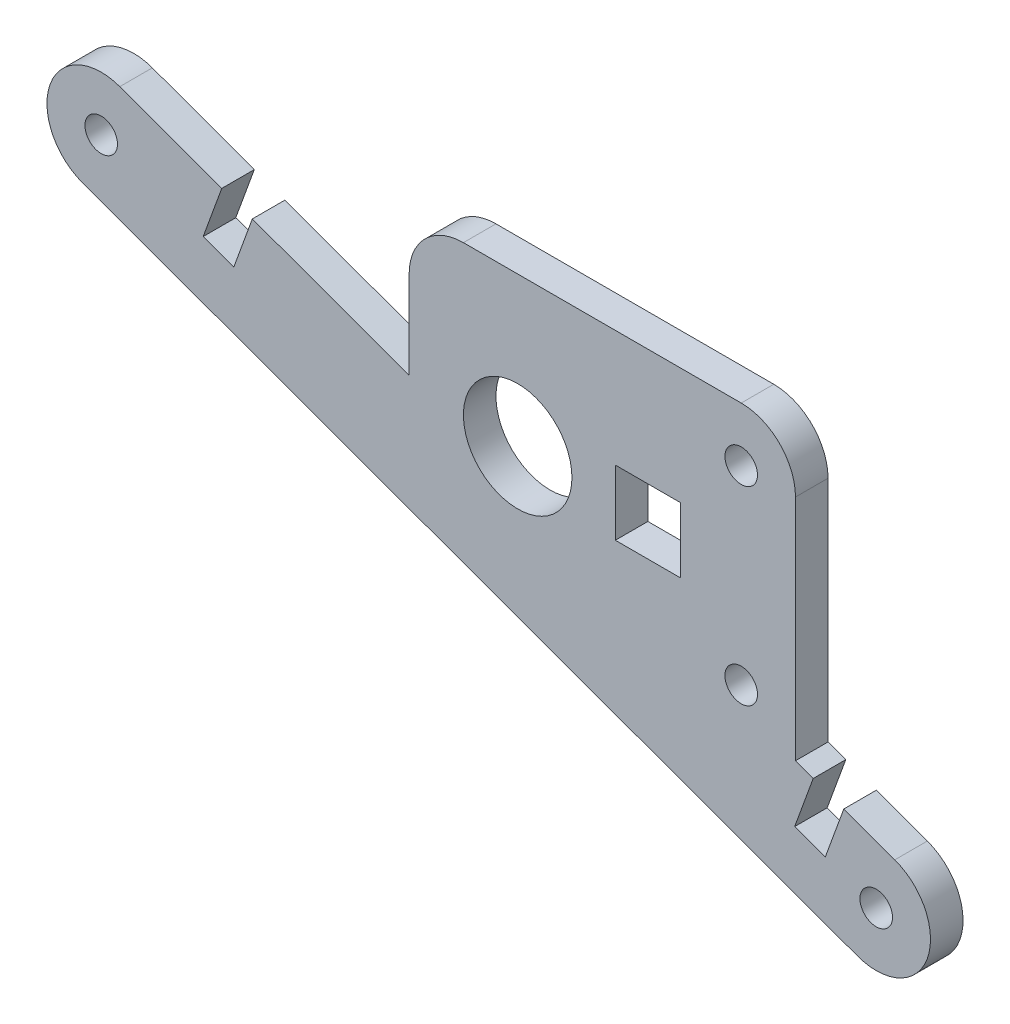
ISO-10303-21;
HEADER;
FILE_DESCRIPTION(('STEP AP214'),'2;1');
FILE_NAME('part.step','',(''),(''),'','','');
FILE_SCHEMA(('AUTOMOTIVE_DESIGN { 1 0 10303 214 1 1 1 1 }'));
ENDSEC;
DATA;
#1=APPLICATION_CONTEXT('core data for automotive mechanical design processes');
#2=APPLICATION_PROTOCOL_DEFINITION('international standard','automotive_design',2000,#1);
#3=PRODUCT_CONTEXT('',#1,'mechanical');
#4=PRODUCT('Part','Part','',(#3));
#5=PRODUCT_RELATED_PRODUCT_CATEGORY('part','',(#4));
#6=PRODUCT_DEFINITION_FORMATION('','',#4);
#7=PRODUCT_DEFINITION_CONTEXT('part definition',#1,'design');
#8=PRODUCT_DEFINITION('design','',#6,#7);
#9=PRODUCT_DEFINITION_SHAPE('','',#8);
#10=(LENGTH_UNIT() NAMED_UNIT(*) SI_UNIT(.MILLI.,.METRE.));
#11=(NAMED_UNIT(*) PLANE_ANGLE_UNIT() SI_UNIT($,.RADIAN.));
#12=(NAMED_UNIT(*) SI_UNIT($,.STERADIAN.) SOLID_ANGLE_UNIT());
#13=UNCERTAINTY_MEASURE_WITH_UNIT(LENGTH_MEASURE(1.E-05),#10,'distance_accuracy_value','');
#14=(GEOMETRIC_REPRESENTATION_CONTEXT(3) GLOBAL_UNCERTAINTY_ASSIGNED_CONTEXT((#13)) GLOBAL_UNIT_ASSIGNED_CONTEXT((#10,
#11,#12)) REPRESENTATION_CONTEXT('',''));
#15=CARTESIAN_POINT('',(0.,0.,0.));
#16=DIRECTION('',(0.,0.,1.));
#17=DIRECTION('',(1.,0.,0.));
#18=AXIS2_PLACEMENT_3D('',#15,#16,#17);
#19=CARTESIAN_POINT('',(-10.,0.660004579729409,3.));
#20=DIRECTION('',(-0.342020143325663,-0.939692620785911,0.));
#21=DIRECTION('',(0.939692620785911,-0.342020143325663,0.));
#22=AXIS2_PLACEMENT_3D('',#19,#20,#21);
#23=PLANE('',#22);
#24=DIRECTION('',(-0.939692620785911,0.342020143325663,0.));
#25=VECTOR('',#24,1.);
#26=CARTESIAN_POINT('',(-10.,0.660004579729409,0.));
#27=LINE('',#26,#25);
#28=CARTESIAN_POINT('',(-10.,0.660004579729409,0.));
#29=VERTEX_POINT('',#28);
#30=CARTESIAN_POINT('',(-24.4499719209596,5.91936424494102,0.));
#31=VERTEX_POINT('',#30);
#32=EDGE_CURVE('E343',#29,#31,#27,.T.);
#33=ORIENTED_EDGE('',*,*,#32,.T.);
#34=DIRECTION('',(0.,0.,-1.));
#35=VECTOR('',#34,1.);
#36=CARTESIAN_POINT('',(-24.4499719209596,5.91936424494102,3.));
#37=LINE('',#36,#35);
#38=CARTESIAN_POINT('',(-24.4499719209596,5.91936424494102,3.));
#39=VERTEX_POINT('',#38);
#40=EDGE_CURVE('E219',#39,#31,#37,.T.);
#41=ORIENTED_EDGE('',*,*,#40,.F.);
#42=DIRECTION('',(-0.939692620785911,0.342020143325663,0.));
#43=VECTOR('',#42,1.);
#44=CARTESIAN_POINT('',(-10.,0.660004579729409,3.));
#45=LINE('',#44,#43);
#46=CARTESIAN_POINT('',(-10.,0.660004579729409,3.));
#47=VERTEX_POINT('',#46);
#48=EDGE_CURVE('E210',#47,#39,#45,.T.);
#49=ORIENTED_EDGE('',*,*,#48,.F.);
#50=DIRECTION('',(0.,0.,-1.));
#51=VECTOR('',#50,1.);
#52=CARTESIAN_POINT('',(-10.,0.660004579729409,3.));
#53=LINE('',#52,#51);
#54=EDGE_CURVE('E369',#47,#29,#53,.T.);
#55=ORIENTED_EDGE('',*,*,#54,.T.);
#56=EDGE_LOOP('',(#33,#41,#49,#55));
#57=FACE_BOUND('',#56,.T.);
#58=ADVANCED_FACE('F37',(#57),#23,.F.);
#59=CARTESIAN_POINT('',(34.7506631885527,-15.6279047845757,3.));
#60=DIRECTION('',(-0.342020143325662,-0.939692620785911,0.));
#61=DIRECTION('',(0.939692620785911,-0.342020143325662,0.));
#62=AXIS2_PLACEMENT_3D('',#59,#60,#61);
#63=PLANE('',#62);
#64=DIRECTION('',(-0.939692620785911,0.342020143325662,0.));
#65=VECTOR('',#64,1.);
#66=CARTESIAN_POINT('',(34.7506631885527,-15.6279047845757,0.));
#67=LINE('',#66,#65);
#68=CARTESIAN_POINT('',(34.7506631885527,-15.6279047845758,0.));
#69=VERTEX_POINT('',#68);
#70=CARTESIAN_POINT('',(30.0522000846232,-13.9178040679474,0.));
#71=VERTEX_POINT('',#70);
#72=EDGE_CURVE('E312',#69,#71,#67,.T.);
#73=ORIENTED_EDGE('',*,*,#72,.T.);
#74=DIRECTION('',(0.,0.,-1.));
#75=VECTOR('',#74,1.);
#76=CARTESIAN_POINT('',(30.0522000846232,-13.9178040679474,3.));
#77=LINE('',#76,#75);
#78=CARTESIAN_POINT('',(30.0522000846232,-13.9178040679474,3.));
#79=VERTEX_POINT('',#78);
#80=EDGE_CURVE('E232',#79,#71,#77,.T.);
#81=ORIENTED_EDGE('',*,*,#80,.F.);
#82=DIRECTION('',(-0.939692620785911,0.342020143325662,0.));
#83=VECTOR('',#82,1.);
#84=CARTESIAN_POINT('',(34.7506631885527,-15.6279047845757,3.));
#85=LINE('',#84,#83);
#86=CARTESIAN_POINT('',(34.7506631885527,-15.6279047845758,3.));
#87=VERTEX_POINT('',#86);
#88=EDGE_CURVE('E329',#87,#79,#85,.T.);
#89=ORIENTED_EDGE('',*,*,#88,.F.);
#90=DIRECTION('',(0.,0.,-1.));
#91=VECTOR('',#90,1.);
#92=CARTESIAN_POINT('',(34.7506631885527,-15.6279047845758,3.));
#93=LINE('',#92,#91);
#94=EDGE_CURVE('E357',#87,#69,#93,.T.);
#95=ORIENTED_EDGE('',*,*,#94,.T.);
#96=EDGE_LOOP('',(#73,#81,#89,#95));
#97=FACE_BOUND('',#96,.T.);
#98=ADVANCED_FACE('F423',(#97),#63,.F.);
#99=CARTESIAN_POINT('',(20.6,8.75000000000001,3.));
#100=DIRECTION('',(0.,0.,1.));
#101=DIRECTION('',(1.,0.,0.));
#102=AXIS2_PLACEMENT_3D('',#99,#100,#101);
#103=PLANE('',#102);
#104=DIRECTION('',(-0.342020143325663,-0.93969262078591,0.));
#105=VECTOR('',#104,1.);
#106=CARTESIAN_POINT('',(-26.1600726375879,1.22090114101147,3.));
#107=LINE('',#106,#105);
#108=CARTESIAN_POINT('',(-26.1600726375879,1.22090114101147,3.));
#109=VERTEX_POINT('',#108);
#110=EDGE_CURVE('E189',#39,#109,#107,.T.);
#111=ORIENTED_EDGE('',*,*,#110,.T.);
#112=DIRECTION('',(-0.93969262078591,0.342020143325663,0.));
#113=VECTOR('',#112,1.);
#114=CARTESIAN_POINT('',(-28.9791504999457,2.24696157098846,3.));
#115=LINE('',#114,#113);
#116=CARTESIAN_POINT('',(-28.9791504999457,2.24696157098846,3.));
#117=VERTEX_POINT('',#116);
#118=EDGE_CURVE('E200',#109,#117,#115,.T.);
#119=ORIENTED_EDGE('',*,*,#118,.T.);
#120=DIRECTION('',(0.342020143325663,0.939692620785911,0.));
#121=VECTOR('',#120,1.);
#122=CARTESIAN_POINT('',(-27.2690497833174,6.94542467491801,3.));
#123=LINE('',#122,#121);
#124=CARTESIAN_POINT('',(-27.2690497833174,6.94542467491801,3.));
#125=VERTEX_POINT('',#124);
#126=EDGE_CURVE('E197',#117,#125,#123,.T.);
#127=ORIENTED_EDGE('',*,*,#126,.T.);
#128=CARTESIAN_POINT('',(-36.6659759911765,10.3656261081746,3.));
#129=VERTEX_POINT('',#128);
#130=EDGE_CURVE('E320',#125,#129,#45,.T.);
#131=ORIENTED_EDGE('',*,*,#130,.T.);
#132=CARTESIAN_POINT('',(-38.3760767078048,5.66716300424508,3.));
#133=DIRECTION('',(0.,0.,1.));
#134=DIRECTION('',(1.,0.,0.));
#135=AXIS2_PLACEMENT_3D('',#132,#133,#134);
#136=CIRCLE('',#135,5.);
#137=CARTESIAN_POINT('',(-40.0861774244331,0.96869990031553,3.));
#138=VERTEX_POINT('',#137);
#139=EDGE_CURVE('E322',#129,#138,#136,.T.);
#140=ORIENTED_EDGE('',*,*,#139,.T.);
#141=DIRECTION('',(0.939692620785911,-0.342020143325662,0.));
#142=VECTOR('',#141,1.);
#143=CARTESIAN_POINT('',(-40.0861774244331,0.968699900315528,3.));
#144=LINE('',#143,#142);
#145=CARTESIAN_POINT('',(31.3304617552961,-25.0248309924348,3.));
#146=VERTEX_POINT('',#145);
#147=EDGE_CURVE('E324',#138,#146,#144,.T.);
#148=ORIENTED_EDGE('',*,*,#147,.T.);
#149=CARTESIAN_POINT('',(33.0405624719244,-20.3263678885053,3.));
#150=DIRECTION('',(0.,0.,1.));
#151=DIRECTION('',(1.,0.,0.));
#152=AXIS2_PLACEMENT_3D('',#149,#150,#151);
#153=CIRCLE('',#152,4.99999999999998);
#154=EDGE_CURVE('E326',#146,#87,#153,.T.);
#155=ORIENTED_EDGE('',*,*,#154,.T.);
#156=ORIENTED_EDGE('',*,*,#88,.T.);
#157=DIRECTION('',(-0.342020143325663,-0.93969262078591,0.));
#158=VECTOR('',#157,1.);
#159=CARTESIAN_POINT('',(28.3420993679949,-18.616267171877,3.));
#160=LINE('',#159,#158);
#161=CARTESIAN_POINT('',(28.3420993679949,-18.616267171877,3.));
#162=VERTEX_POINT('',#161);
#163=EDGE_CURVE('E236',#79,#162,#160,.T.);
#164=ORIENTED_EDGE('',*,*,#163,.T.);
#165=DIRECTION('',(-0.93969262078591,0.342020143325664,0.));
#166=VECTOR('',#165,1.);
#167=CARTESIAN_POINT('',(25.5230215056371,-17.5902067419,3.));
#168=LINE('',#167,#166);
#169=CARTESIAN_POINT('',(25.5230215056371,-17.5902067419,3.));
#170=VERTEX_POINT('',#169);
#171=EDGE_CURVE('E243',#162,#170,#168,.T.);
#172=ORIENTED_EDGE('',*,*,#171,.T.);
#173=DIRECTION('',(0.342020143325664,0.93969262078591,0.));
#174=VECTOR('',#173,1.);
#175=CARTESIAN_POINT('',(27.2331222222655,-12.8917436379704,3.));
#176=LINE('',#175,#174);
#177=CARTESIAN_POINT('',(27.2331222222655,-12.8917436379704,3.));
#178=VERTEX_POINT('',#177);
#179=EDGE_CURVE('E227',#170,#178,#176,.T.);
#180=ORIENTED_EDGE('',*,*,#179,.T.);
#181=CARTESIAN_POINT('',(25.6,-12.2973357601472,3.));
#182=VERTEX_POINT('',#181);
#183=EDGE_CURVE('E328',#178,#182,#85,.T.);
#184=ORIENTED_EDGE('',*,*,#183,.T.);
#185=DIRECTION('',(0.,1.,0.));
#186=VECTOR('',#185,1.);
#187=CARTESIAN_POINT('',(25.6,-12.2973357601472,3.));
#188=LINE('',#187,#186);
#189=CARTESIAN_POINT('',(25.6,8.74999999999997,3.));
#190=VERTEX_POINT('',#189);
#191=EDGE_CURVE('E309',#182,#190,#188,.T.);
#192=ORIENTED_EDGE('',*,*,#191,.T.);
#193=CARTESIAN_POINT('',(20.6,8.75000000000001,3.));
#194=DIRECTION('',(0.,0.,1.));
#195=DIRECTION('',(1.,0.,0.));
#196=AXIS2_PLACEMENT_3D('',#193,#194,#195);
#197=CIRCLE('',#196,5.);
#198=CARTESIAN_POINT('',(20.6,13.75,3.));
#199=VERTEX_POINT('',#198);
#200=EDGE_CURVE('E311',#190,#199,#197,.T.);
#201=ORIENTED_EDGE('',*,*,#200,.T.);
#202=DIRECTION('',(-1.,0.,0.));
#203=VECTOR('',#202,1.);
#204=CARTESIAN_POINT('',(20.6,13.75,3.));
#205=LINE('',#204,#203);
#206=CARTESIAN_POINT('',(-4.99999999999997,13.75,3.));
#207=VERTEX_POINT('',#206);
#208=EDGE_CURVE('E314',#199,#207,#205,.T.);
#209=ORIENTED_EDGE('',*,*,#208,.T.);
#210=CARTESIAN_POINT('',(-5.,8.75,3.));
#211=DIRECTION('',(0.,0.,1.));
#212=DIRECTION('',(-1.,0.,0.));
#213=AXIS2_PLACEMENT_3D('',#210,#211,#212);
#214=CIRCLE('',#213,5.);
#215=CARTESIAN_POINT('',(-10.,8.74999999999996,3.));
#216=VERTEX_POINT('',#215);
#217=EDGE_CURVE('E316',#207,#216,#214,.T.);
#218=ORIENTED_EDGE('',*,*,#217,.T.);
#219=DIRECTION('',(0.,-1.,0.));
#220=VECTOR('',#219,1.);
#221=CARTESIAN_POINT('',(-10.,8.74999999999997,3.));
#222=LINE('',#221,#220);
#223=EDGE_CURVE('E318',#216,#47,#222,.T.);
#224=ORIENTED_EDGE('',*,*,#223,.T.);
#225=ORIENTED_EDGE('',*,*,#48,.T.);
#226=EDGE_LOOP('',(#111,#119,#127,#131,#140,#148,#155,#156,#164,#172,#180,#184,#192,#201,#209,
#218,#224,#225));
#227=FACE_BOUND('',#226,.T.);
#228=CARTESIAN_POINT('',(-38.3760767078048,5.66716300424508,3.));
#229=DIRECTION('',(0.,0.,1.));
#230=DIRECTION('',(1.,0.,0.));
#231=AXIS2_PLACEMENT_3D('',#228,#229,#230);
#232=CIRCLE('',#231,1.5);
#233=CARTESIAN_POINT('',(-36.8760767078048,5.66716300424508,3.));
#234=VERTEX_POINT('',#233);
#235=EDGE_CURVE('E254',#234,#234,#232,.T.);
#236=ORIENTED_EDGE('',*,*,#235,.F.);
#237=EDGE_LOOP('',(#236));
#238=FACE_BOUND('',#237,.T.);
#239=CARTESIAN_POINT('',(20.6,8.75,3.));
#240=DIRECTION('',(0.,0.,1.));
#241=DIRECTION('',(1.,0.,0.));
#242=AXIS2_PLACEMENT_3D('',#239,#240,#241);
#243=CIRCLE('',#242,1.5);
#244=CARTESIAN_POINT('',(22.1,8.75,3.));
#245=VERTEX_POINT('',#244);
#246=EDGE_CURVE('E297',#245,#245,#243,.T.);
#247=ORIENTED_EDGE('',*,*,#246,.F.);
#248=EDGE_LOOP('',(#247));
#249=FACE_BOUND('',#248,.T.);
#250=CARTESIAN_POINT('',(0.,0.,3.));
#251=DIRECTION('',(0.,0.,1.));
#252=DIRECTION('',(1.,0.,0.));
#253=AXIS2_PLACEMENT_3D('',#250,#251,#252);
#254=CIRCLE('',#253,5.);
#255=CARTESIAN_POINT('',(5.,0.,3.));
#256=VERTEX_POINT('',#255);
#257=EDGE_CURVE('E303',#256,#256,#254,.T.);
#258=ORIENTED_EDGE('',*,*,#257,.F.);
#259=EDGE_LOOP('',(#258));
#260=FACE_BOUND('',#259,.T.);
#261=CARTESIAN_POINT('',(20.6,-8.75,3.));
#262=DIRECTION('',(0.,0.,1.));
#263=DIRECTION('',(1.,0.,0.));
#264=AXIS2_PLACEMENT_3D('',#261,#262,#263);
#265=CIRCLE('',#264,1.5);
#266=CARTESIAN_POINT('',(22.1,-8.75,3.));
#267=VERTEX_POINT('',#266);
#268=EDGE_CURVE('E291',#267,#267,#265,.T.);
#269=ORIENTED_EDGE('',*,*,#268,.F.);
#270=EDGE_LOOP('',(#269));
#271=FACE_BOUND('',#270,.T.);
#272=DIRECTION('',(-1.,0.,0.));
#273=VECTOR('',#272,1.);
#274=CARTESIAN_POINT('',(9.,3.,3.));
#275=LINE('',#274,#273);
#276=CARTESIAN_POINT('',(15.,3.,3.));
#277=VERTEX_POINT('',#276);
#278=CARTESIAN_POINT('',(9.,3.,3.));
#279=VERTEX_POINT('',#278);
#280=EDGE_CURVE('E262',#277,#279,#275,.T.);
#281=ORIENTED_EDGE('',*,*,#280,.F.);
#282=DIRECTION('',(0.,1.,0.));
#283=VECTOR('',#282,1.);
#284=CARTESIAN_POINT('',(15.,-3.,3.));
#285=LINE('',#284,#283);
#286=CARTESIAN_POINT('',(15.,-3.,3.));
#287=VERTEX_POINT('',#286);
#288=EDGE_CURVE('E260',#287,#277,#285,.T.);
#289=ORIENTED_EDGE('',*,*,#288,.F.);
#290=DIRECTION('',(1.,0.,0.));
#291=VECTOR('',#290,1.);
#292=CARTESIAN_POINT('',(9.,-3.,3.));
#293=LINE('',#292,#291);
#294=CARTESIAN_POINT('',(9.,-3.,3.));
#295=VERTEX_POINT('',#294);
#296=EDGE_CURVE('E268',#295,#287,#293,.T.);
#297=ORIENTED_EDGE('',*,*,#296,.F.);
#298=DIRECTION('',(0.,-1.,0.));
#299=VECTOR('',#298,1.);
#300=CARTESIAN_POINT('',(9.,-3.,3.));
#301=LINE('',#300,#299);
#302=EDGE_CURVE('E265',#279,#295,#301,.T.);
#303=ORIENTED_EDGE('',*,*,#302,.F.);
#304=EDGE_LOOP('',(#281,#289,#297,#303));
#305=FACE_BOUND('',#304,.T.);
#306=CARTESIAN_POINT('',(33.0405624719244,-20.3263678885053,3.));
#307=DIRECTION('',(0.,0.,1.));
#308=DIRECTION('',(1.,0.,0.));
#309=AXIS2_PLACEMENT_3D('',#306,#307,#308);
#310=CIRCLE('',#309,1.5);
#311=CARTESIAN_POINT('',(34.5405624719244,-20.3263678885053,3.));
#312=VERTEX_POINT('',#311);
#313=EDGE_CURVE('E248',#312,#312,#310,.T.);
#314=ORIENTED_EDGE('',*,*,#313,.F.);
#315=EDGE_LOOP('',(#314));
#316=FACE_BOUND('',#315,.T.);
#317=ADVANCED_FACE('F207',(#227,#238,#249,#260,#271,#305,#316),#103,.T.);
#318=CARTESIAN_POINT('',(20.6,8.75000000000001,0.));
#319=DIRECTION('',(0.,0.,1.));
#320=DIRECTION('',(1.,0.,0.));
#321=AXIS2_PLACEMENT_3D('',#318,#319,#320);
#322=PLANE('',#321);
#323=CARTESIAN_POINT('',(20.6,-8.75,0.));
#324=DIRECTION('',(0.,0.,1.));
#325=DIRECTION('',(1.,0.,0.));
#326=AXIS2_PLACEMENT_3D('',#323,#324,#325);
#327=CIRCLE('',#326,1.5);
#328=CARTESIAN_POINT('',(22.1,-8.75,0.));
#329=VERTEX_POINT('',#328);
#330=EDGE_CURVE('E290',#329,#329,#327,.T.);
#331=ORIENTED_EDGE('',*,*,#330,.T.);
#332=EDGE_LOOP('',(#331));
#333=FACE_BOUND('',#332,.T.);
#334=CARTESIAN_POINT('',(20.6,8.75,0.));
#335=DIRECTION('',(0.,0.,1.));
#336=DIRECTION('',(1.,0.,0.));
#337=AXIS2_PLACEMENT_3D('',#334,#335,#336);
#338=CIRCLE('',#337,1.5);
#339=CARTESIAN_POINT('',(22.1,8.75,0.));
#340=VERTEX_POINT('',#339);
#341=EDGE_CURVE('E294',#340,#340,#338,.T.);
#342=ORIENTED_EDGE('',*,*,#341,.T.);
#343=EDGE_LOOP('',(#342));
#344=FACE_BOUND('',#343,.T.);
#345=CARTESIAN_POINT('',(0.,0.,0.));
#346=DIRECTION('',(0.,0.,1.));
#347=DIRECTION('',(1.,0.,0.));
#348=AXIS2_PLACEMENT_3D('',#345,#346,#347);
#349=CIRCLE('',#348,5.);
#350=CARTESIAN_POINT('',(5.,0.,0.));
#351=VERTEX_POINT('',#350);
#352=EDGE_CURVE('E300',#351,#351,#349,.T.);
#353=ORIENTED_EDGE('',*,*,#352,.T.);
#354=EDGE_LOOP('',(#353));
#355=FACE_BOUND('',#354,.T.);
#356=DIRECTION('',(-0.93969262078591,0.342020143325663,0.));
#357=VECTOR('',#356,1.);
#358=CARTESIAN_POINT('',(-28.9791504999457,2.24696157098846,0.));
#359=LINE('',#358,#357);
#360=CARTESIAN_POINT('',(-26.1600726375879,1.22090114101147,0.));
#361=VERTEX_POINT('',#360);
#362=CARTESIAN_POINT('',(-28.9791504999457,2.24696157098846,0.));
#363=VERTEX_POINT('',#362);
#364=EDGE_CURVE('E212',#361,#363,#359,.T.);
#365=ORIENTED_EDGE('',*,*,#364,.F.);
#366=DIRECTION('',(-0.342020143325663,-0.93969262078591,0.));
#367=VECTOR('',#366,1.);
#368=CARTESIAN_POINT('',(-26.1600726375879,1.22090114101147,0.));
#369=LINE('',#368,#367);
#370=EDGE_CURVE('E192',#31,#361,#369,.T.);
#371=ORIENTED_EDGE('',*,*,#370,.F.);
#372=ORIENTED_EDGE('',*,*,#32,.F.);
#373=DIRECTION('',(0.,-1.,0.));
#374=VECTOR('',#373,1.);
#375=CARTESIAN_POINT('',(-10.,8.74999999999997,0.));
#376=LINE('',#375,#374);
#377=CARTESIAN_POINT('',(-10.,8.74999999999996,0.));
#378=VERTEX_POINT('',#377);
#379=EDGE_CURVE('E340',#378,#29,#376,.T.);
#380=ORIENTED_EDGE('',*,*,#379,.F.);
#381=CARTESIAN_POINT('',(-5.,8.75,0.));
#382=DIRECTION('',(0.,0.,1.));
#383=DIRECTION('',(-1.,0.,0.));
#384=AXIS2_PLACEMENT_3D('',#381,#382,#383);
#385=CIRCLE('',#384,5.);
#386=CARTESIAN_POINT('',(-4.99999999999997,13.75,0.));
#387=VERTEX_POINT('',#386);
#388=EDGE_CURVE('E338',#387,#378,#385,.T.);
#389=ORIENTED_EDGE('',*,*,#388,.F.);
#390=DIRECTION('',(-1.,0.,0.));
#391=VECTOR('',#390,1.);
#392=CARTESIAN_POINT('',(20.6,13.75,0.));
#393=LINE('',#392,#391);
#394=CARTESIAN_POINT('',(20.6,13.75,0.));
#395=VERTEX_POINT('',#394);
#396=EDGE_CURVE('E336',#395,#387,#393,.T.);
#397=ORIENTED_EDGE('',*,*,#396,.F.);
#398=CARTESIAN_POINT('',(20.6,8.75000000000001,0.));
#399=DIRECTION('',(0.,0.,1.));
#400=DIRECTION('',(1.,0.,0.));
#401=AXIS2_PLACEMENT_3D('',#398,#399,#400);
#402=CIRCLE('',#401,5.);
#403=CARTESIAN_POINT('',(25.6,8.74999999999997,0.));
#404=VERTEX_POINT('',#403);
#405=EDGE_CURVE('E334',#404,#395,#402,.T.);
#406=ORIENTED_EDGE('',*,*,#405,.F.);
#407=DIRECTION('',(0.,1.,0.));
#408=VECTOR('',#407,1.);
#409=CARTESIAN_POINT('',(25.6,-12.0313580199362,0.));
#410=LINE('',#409,#408);
#411=CARTESIAN_POINT('',(25.6,-12.2973357601472,0.));
#412=VERTEX_POINT('',#411);
#413=EDGE_CURVE('E306',#412,#404,#410,.T.);
#414=ORIENTED_EDGE('',*,*,#413,.F.);
#415=CARTESIAN_POINT('',(27.2331222222655,-12.8917436379704,0.));
#416=VERTEX_POINT('',#415);
#417=EDGE_CURVE('E352',#416,#412,#67,.T.);
#418=ORIENTED_EDGE('',*,*,#417,.F.);
#419=DIRECTION('',(0.342020143325664,0.93969262078591,0.));
#420=VECTOR('',#419,1.);
#421=CARTESIAN_POINT('',(27.2331222222655,-12.8917436379704,0.));
#422=LINE('',#421,#420);
#423=CARTESIAN_POINT('',(25.5230215056371,-17.5902067419,0.));
#424=VERTEX_POINT('',#423);
#425=EDGE_CURVE('E60',#424,#416,#422,.T.);
#426=ORIENTED_EDGE('',*,*,#425,.F.);
#427=DIRECTION('',(-0.93969262078591,0.342020143325664,0.));
#428=VECTOR('',#427,1.);
#429=CARTESIAN_POINT('',(25.5230215056371,-17.5902067419,0.));
#430=LINE('',#429,#428);
#431=CARTESIAN_POINT('',(28.3420993679949,-18.616267171877,0.));
#432=VERTEX_POINT('',#431);
#433=EDGE_CURVE('E235',#432,#424,#430,.T.);
#434=ORIENTED_EDGE('',*,*,#433,.F.);
#435=DIRECTION('',(-0.342020143325663,-0.93969262078591,0.));
#436=VECTOR('',#435,1.);
#437=CARTESIAN_POINT('',(28.3420993679949,-18.616267171877,0.));
#438=LINE('',#437,#436);
#439=EDGE_CURVE('E217',#71,#432,#438,.T.);
#440=ORIENTED_EDGE('',*,*,#439,.F.);
#441=ORIENTED_EDGE('',*,*,#72,.F.);
#442=CARTESIAN_POINT('',(33.0405624719244,-20.3263678885053,0.));
#443=DIRECTION('',(0.,0.,1.));
#444=DIRECTION('',(1.,0.,0.));
#445=AXIS2_PLACEMENT_3D('',#442,#443,#444);
#446=CIRCLE('',#445,4.99999999999998);
#447=CARTESIAN_POINT('',(31.3304617552961,-25.0248309924348,0.));
#448=VERTEX_POINT('',#447);
#449=EDGE_CURVE('E350',#448,#69,#446,.T.);
#450=ORIENTED_EDGE('',*,*,#449,.F.);
#451=DIRECTION('',(0.939692620785911,-0.342020143325662,0.));
#452=VECTOR('',#451,1.);
#453=CARTESIAN_POINT('',(-40.0861774244331,0.968699900315528,0.));
#454=LINE('',#453,#452);
#455=CARTESIAN_POINT('',(-40.0861774244331,0.96869990031553,0.));
#456=VERTEX_POINT('',#455);
#457=EDGE_CURVE('E348',#456,#448,#454,.T.);
#458=ORIENTED_EDGE('',*,*,#457,.F.);
#459=CARTESIAN_POINT('',(-38.3760767078048,5.66716300424508,0.));
#460=DIRECTION('',(0.,0.,1.));
#461=DIRECTION('',(1.,0.,0.));
#462=AXIS2_PLACEMENT_3D('',#459,#460,#461);
#463=CIRCLE('',#462,5.);
#464=CARTESIAN_POINT('',(-36.6659759911765,10.3656261081746,0.));
#465=VERTEX_POINT('',#464);
#466=EDGE_CURVE('E346',#465,#456,#463,.T.);
#467=ORIENTED_EDGE('',*,*,#466,.F.);
#468=CARTESIAN_POINT('',(-27.2690497833174,6.94542467491801,0.));
#469=VERTEX_POINT('',#468);
#470=EDGE_CURVE('E342',#469,#465,#27,.T.);
#471=ORIENTED_EDGE('',*,*,#470,.F.);
#472=DIRECTION('',(0.342020143325663,0.939692620785911,0.));
#473=VECTOR('',#472,1.);
#474=CARTESIAN_POINT('',(-27.2690497833174,6.94542467491801,0.));
#475=LINE('',#474,#473);
#476=EDGE_CURVE('E52',#363,#469,#475,.T.);
#477=ORIENTED_EDGE('',*,*,#476,.F.);
#478=EDGE_LOOP('',(#365,#371,#372,#380,#389,#397,#406,#414,#418,#426,#434,#440,#441,#450,#458,
#467,#471,#477));
#479=FACE_BOUND('',#478,.T.);
#480=DIRECTION('',(0.,1.,0.));
#481=VECTOR('',#480,1.);
#482=CARTESIAN_POINT('',(15.,-3.,0.));
#483=LINE('',#482,#481);
#484=CARTESIAN_POINT('',(15.,-3.,0.));
#485=VERTEX_POINT('',#484);
#486=CARTESIAN_POINT('',(15.,3.,0.));
#487=VERTEX_POINT('',#486);
#488=EDGE_CURVE('E257',#485,#487,#483,.T.);
#489=ORIENTED_EDGE('',*,*,#488,.T.);
#490=DIRECTION('',(-1.,0.,0.));
#491=VECTOR('',#490,1.);
#492=CARTESIAN_POINT('',(9.,3.,0.));
#493=LINE('',#492,#491);
#494=CARTESIAN_POINT('',(9.,3.,0.));
#495=VERTEX_POINT('',#494);
#496=EDGE_CURVE('E273',#487,#495,#493,.T.);
#497=ORIENTED_EDGE('',*,*,#496,.T.);
#498=DIRECTION('',(0.,-1.,0.));
#499=VECTOR('',#498,1.);
#500=CARTESIAN_POINT('',(9.,-3.,0.));
#501=LINE('',#500,#499);
#502=CARTESIAN_POINT('',(9.,-3.,0.));
#503=VERTEX_POINT('',#502);
#504=EDGE_CURVE('E276',#495,#503,#501,.T.);
#505=ORIENTED_EDGE('',*,*,#504,.T.);
#506=DIRECTION('',(1.,0.,0.));
#507=VECTOR('',#506,1.);
#508=CARTESIAN_POINT('',(9.,-3.,0.));
#509=LINE('',#508,#507);
#510=EDGE_CURVE('E263',#503,#485,#509,.T.);
#511=ORIENTED_EDGE('',*,*,#510,.T.);
#512=EDGE_LOOP('',(#489,#497,#505,#511));
#513=FACE_BOUND('',#512,.T.);
#514=CARTESIAN_POINT('',(-38.3760767078048,5.66716300424508,0.));
#515=DIRECTION('',(0.,0.,1.));
#516=DIRECTION('',(1.,0.,0.));
#517=AXIS2_PLACEMENT_3D('',#514,#515,#516);
#518=CIRCLE('',#517,1.5);
#519=CARTESIAN_POINT('',(-36.8760767078048,5.66716300424508,0.));
#520=VERTEX_POINT('',#519);
#521=EDGE_CURVE('E251',#520,#520,#518,.T.);
#522=ORIENTED_EDGE('',*,*,#521,.T.);
#523=EDGE_LOOP('',(#522));
#524=FACE_BOUND('',#523,.T.);
#525=CARTESIAN_POINT('',(33.0405624719244,-20.3263678885053,0.));
#526=DIRECTION('',(0.,0.,1.));
#527=DIRECTION('',(1.,0.,0.));
#528=AXIS2_PLACEMENT_3D('',#525,#526,#527);
#529=CIRCLE('',#528,1.5);
#530=CARTESIAN_POINT('',(34.5405624719244,-20.3263678885053,0.));
#531=VERTEX_POINT('',#530);
#532=EDGE_CURVE('E221',#531,#531,#529,.T.);
#533=ORIENTED_EDGE('',*,*,#532,.T.);
#534=EDGE_LOOP('',(#533));
#535=FACE_BOUND('',#534,.T.);
#536=ADVANCED_FACE('F389',(#333,#344,#355,#479,#513,#524,#535),#322,.F.);
#537=CARTESIAN_POINT('',(25.6,-12.0313580199362,3.));
#538=DIRECTION('',(-1.,0.,0.));
#539=DIRECTION('',(0.,0.,1.));
#540=AXIS2_PLACEMENT_3D('',#537,#538,#539);
#541=PLANE('',#540);
#542=ORIENTED_EDGE('',*,*,#413,.T.);
#543=DIRECTION('',(0.,0.,-1.));
#544=VECTOR('',#543,1.);
#545=CARTESIAN_POINT('',(25.6,8.74999999999997,3.));
#546=LINE('',#545,#544);
#547=EDGE_CURVE('E11',#190,#404,#546,.T.);
#548=ORIENTED_EDGE('',*,*,#547,.F.);
#549=ORIENTED_EDGE('',*,*,#191,.F.);
#550=DIRECTION('',(0.,0.,-1.));
#551=VECTOR('',#550,1.);
#552=CARTESIAN_POINT('',(25.6,-12.2973357601472,3.));
#553=LINE('',#552,#551);
#554=EDGE_CURVE('E332',#182,#412,#553,.T.);
#555=ORIENTED_EDGE('',*,*,#554,.T.);
#556=EDGE_LOOP('',(#542,#548,#549,#555));
#557=FACE_BOUND('',#556,.T.);
#558=ADVANCED_FACE('F39',(#557),#541,.F.);
#559=CARTESIAN_POINT('',(20.6,8.75000000000001,3.));
#560=DIRECTION('',(0.,0.,-1.));
#561=DIRECTION('',(-1.,0.,0.));
#562=AXIS2_PLACEMENT_3D('',#559,#560,#561);
#563=CYLINDRICAL_SURFACE('',#562,5.);
#564=ORIENTED_EDGE('',*,*,#405,.T.);
#565=DIRECTION('',(0.,0.,-1.));
#566=VECTOR('',#565,1.);
#567=CARTESIAN_POINT('',(20.6,13.75,3.));
#568=LINE('',#567,#566);
#569=EDGE_CURVE('E45',#199,#395,#568,.T.);
#570=ORIENTED_EDGE('',*,*,#569,.F.);
#571=ORIENTED_EDGE('',*,*,#200,.F.);
#572=ORIENTED_EDGE('',*,*,#547,.T.);
#573=EDGE_LOOP('',(#564,#570,#571,#572));
#574=FACE_BOUND('',#573,.T.);
#575=ADVANCED_FACE('F404',(#574),#563,.T.);
#576=CARTESIAN_POINT('',(20.6,13.75,3.));
#577=DIRECTION('',(0.,-1.,0.));
#578=DIRECTION('',(1.,0.,0.));
#579=AXIS2_PLACEMENT_3D('',#576,#577,#578);
#580=PLANE('',#579);
#581=ORIENTED_EDGE('',*,*,#396,.T.);
#582=DIRECTION('',(0.,0.,-1.));
#583=VECTOR('',#582,1.);
#584=CARTESIAN_POINT('',(-4.99999999999997,13.75,3.));
#585=LINE('',#584,#583);
#586=EDGE_CURVE('E375',#207,#387,#585,.T.);
#587=ORIENTED_EDGE('',*,*,#586,.F.);
#588=ORIENTED_EDGE('',*,*,#208,.F.);
#589=ORIENTED_EDGE('',*,*,#569,.T.);
#590=EDGE_LOOP('',(#581,#587,#588,#589));
#591=FACE_BOUND('',#590,.T.);
#592=ADVANCED_FACE('F382',(#591),#580,.F.);
#593=CARTESIAN_POINT('',(-5.,8.75,3.));
#594=DIRECTION('',(0.,0.,-1.));
#595=DIRECTION('',(-1.,0.,0.));
#596=AXIS2_PLACEMENT_3D('',#593,#594,#595);
#597=CYLINDRICAL_SURFACE('',#596,5.);
#598=ORIENTED_EDGE('',*,*,#388,.T.);
#599=DIRECTION('',(0.,0.,-1.));
#600=VECTOR('',#599,1.);
#601=CARTESIAN_POINT('',(-10.,8.74999999999996,3.));
#602=LINE('',#601,#600);
#603=EDGE_CURVE('E372',#216,#378,#602,.T.);
#604=ORIENTED_EDGE('',*,*,#603,.F.);
#605=ORIENTED_EDGE('',*,*,#217,.F.);
#606=ORIENTED_EDGE('',*,*,#586,.T.);
#607=EDGE_LOOP('',(#598,#604,#605,#606));
#608=FACE_BOUND('',#607,.T.);
#609=ADVANCED_FACE('F396',(#608),#597,.T.);
#610=CARTESIAN_POINT('',(-10.,8.74999999999997,3.));
#611=DIRECTION('',(1.,0.,0.));
#612=DIRECTION('',(0.,1.,0.));
#613=AXIS2_PLACEMENT_3D('',#610,#611,#612);
#614=PLANE('',#613);
#615=ORIENTED_EDGE('',*,*,#379,.T.);
#616=ORIENTED_EDGE('',*,*,#54,.F.);
#617=ORIENTED_EDGE('',*,*,#223,.F.);
#618=ORIENTED_EDGE('',*,*,#603,.T.);
#619=EDGE_LOOP('',(#615,#616,#617,#618));
#620=FACE_BOUND('',#619,.T.);
#621=ADVANCED_FACE('F400',(#620),#614,.F.);
#622=ORIENTED_EDGE('',*,*,#130,.F.);
#623=DIRECTION('',(0.,0.,-1.));
#624=VECTOR('',#623,1.);
#625=CARTESIAN_POINT('',(-27.2690497833174,6.94542467491801,3.));
#626=LINE('',#625,#624);
#627=EDGE_CURVE('E222',#125,#469,#626,.T.);
#628=ORIENTED_EDGE('',*,*,#627,.T.);
#629=ORIENTED_EDGE('',*,*,#470,.T.);
#630=DIRECTION('',(0.,0.,-1.));
#631=VECTOR('',#630,1.);
#632=CARTESIAN_POINT('',(-36.6659759911765,10.3656261081746,3.));
#633=LINE('',#632,#631);
#634=EDGE_CURVE('E366',#129,#465,#633,.T.);
#635=ORIENTED_EDGE('',*,*,#634,.F.);
#636=EDGE_LOOP('',(#622,#628,#629,#635));
#637=FACE_BOUND('',#636,.T.);
#638=ADVANCED_FACE('F443',(#637),#23,.F.);
#639=CARTESIAN_POINT('',(-38.3760767078048,5.66716300424508,3.));
#640=DIRECTION('',(0.,0.,-1.));
#641=DIRECTION('',(-1.,0.,0.));
#642=AXIS2_PLACEMENT_3D('',#639,#640,#641);
#643=CYLINDRICAL_SURFACE('',#642,5.);
#644=ORIENTED_EDGE('',*,*,#466,.T.);
#645=DIRECTION('',(0.,0.,-1.));
#646=VECTOR('',#645,1.);
#647=CARTESIAN_POINT('',(-40.0861774244331,0.96869990031553,3.));
#648=LINE('',#647,#646);
#649=EDGE_CURVE('E363',#138,#456,#648,.T.);
#650=ORIENTED_EDGE('',*,*,#649,.F.);
#651=ORIENTED_EDGE('',*,*,#139,.F.);
#652=ORIENTED_EDGE('',*,*,#634,.T.);
#653=EDGE_LOOP('',(#644,#650,#651,#652));
#654=FACE_BOUND('',#653,.T.);
#655=ADVANCED_FACE('F439',(#654),#643,.T.);
#656=CARTESIAN_POINT('',(-40.0861774244331,0.968699900315528,3.));
#657=DIRECTION('',(0.342020143325662,0.939692620785911,0.));
#658=DIRECTION('',(-0.939692620785911,0.342020143325662,0.));
#659=AXIS2_PLACEMENT_3D('',#656,#657,#658);
#660=PLANE('',#659);
#661=ORIENTED_EDGE('',*,*,#457,.T.);
#662=DIRECTION('',(0.,0.,-1.));
#663=VECTOR('',#662,1.);
#664=CARTESIAN_POINT('',(31.3304617552961,-25.0248309924348,3.));
#665=LINE('',#664,#663);
#666=EDGE_CURVE('E360',#146,#448,#665,.T.);
#667=ORIENTED_EDGE('',*,*,#666,.F.);
#668=ORIENTED_EDGE('',*,*,#147,.F.);
#669=ORIENTED_EDGE('',*,*,#649,.T.);
#670=EDGE_LOOP('',(#661,#667,#668,#669));
#671=FACE_BOUND('',#670,.T.);
#672=ADVANCED_FACE('F434',(#671),#660,.F.);
#673=CARTESIAN_POINT('',(33.0405624719244,-20.3263678885053,3.));
#674=DIRECTION('',(0.,0.,-1.));
#675=DIRECTION('',(-1.,0.,0.));
#676=AXIS2_PLACEMENT_3D('',#673,#674,#675);
#677=CYLINDRICAL_SURFACE('',#676,4.99999999999998);
#678=ORIENTED_EDGE('',*,*,#449,.T.);
#679=ORIENTED_EDGE('',*,*,#94,.F.);
#680=ORIENTED_EDGE('',*,*,#154,.F.);
#681=ORIENTED_EDGE('',*,*,#666,.T.);
#682=EDGE_LOOP('',(#678,#679,#680,#681));
#683=FACE_BOUND('',#682,.T.);
#684=ADVANCED_FACE('F428',(#683),#677,.T.);
#685=ORIENTED_EDGE('',*,*,#183,.F.);
#686=DIRECTION('',(0.,0.,-1.));
#687=VECTOR('',#686,1.);
#688=CARTESIAN_POINT('',(27.2331222222655,-12.8917436379704,3.));
#689=LINE('',#688,#687);
#690=EDGE_CURVE('E230',#178,#416,#689,.T.);
#691=ORIENTED_EDGE('',*,*,#690,.T.);
#692=ORIENTED_EDGE('',*,*,#417,.T.);
#693=ORIENTED_EDGE('',*,*,#554,.F.);
#694=EDGE_LOOP('',(#685,#691,#692,#693));
#695=FACE_BOUND('',#694,.T.);
#696=ADVANCED_FACE('F411',(#695),#63,.F.);
#697=CARTESIAN_POINT('',(0.,0.,3.));
#698=DIRECTION('',(0.,0.,-1.));
#699=DIRECTION('',(-1.,0.,0.));
#700=AXIS2_PLACEMENT_3D('',#697,#698,#699);
#701=CYLINDRICAL_SURFACE('',#700,5.);
#702=ORIENTED_EDGE('',*,*,#257,.T.);
#703=EDGE_LOOP('',(#702));
#704=FACE_BOUND('',#703,.T.);
#705=ORIENTED_EDGE('',*,*,#352,.F.);
#706=EDGE_LOOP('',(#705));
#707=FACE_BOUND('',#706,.T.);
#708=ADVANCED_FACE('F482',(#704,#707),#701,.F.);
#709=CARTESIAN_POINT('',(20.6,8.75,3.));
#710=DIRECTION('',(0.,0.,-1.));
#711=DIRECTION('',(-1.,0.,0.));
#712=AXIS2_PLACEMENT_3D('',#709,#710,#711);
#713=CYLINDRICAL_SURFACE('',#712,1.5);
#714=ORIENTED_EDGE('',*,*,#246,.T.);
#715=EDGE_LOOP('',(#714));
#716=FACE_BOUND('',#715,.T.);
#717=ORIENTED_EDGE('',*,*,#341,.F.);
#718=EDGE_LOOP('',(#717));
#719=FACE_BOUND('',#718,.T.);
#720=ADVANCED_FACE('F509',(#716,#719),#713,.F.);
#721=CARTESIAN_POINT('',(20.6,-8.75,3.));
#722=DIRECTION('',(0.,0.,-1.));
#723=DIRECTION('',(-1.,0.,0.));
#724=AXIS2_PLACEMENT_3D('',#721,#722,#723);
#725=CYLINDRICAL_SURFACE('',#724,1.5);
#726=ORIENTED_EDGE('',*,*,#268,.T.);
#727=EDGE_LOOP('',(#726));
#728=FACE_BOUND('',#727,.T.);
#729=ORIENTED_EDGE('',*,*,#330,.F.);
#730=EDGE_LOOP('',(#729));
#731=FACE_BOUND('',#730,.T.);
#732=ADVANCED_FACE('F515',(#728,#731),#725,.F.);
#733=CARTESIAN_POINT('',(15.,-3.,3.));
#734=DIRECTION('',(-1.,0.,0.));
#735=DIRECTION('',(0.,0.,1.));
#736=AXIS2_PLACEMENT_3D('',#733,#734,#735);
#737=PLANE('',#736);
#738=ORIENTED_EDGE('',*,*,#488,.F.);
#739=DIRECTION('',(0.,0.,-1.));
#740=VECTOR('',#739,1.);
#741=CARTESIAN_POINT('',(15.,-3.,3.));
#742=LINE('',#741,#740);
#743=EDGE_CURVE('E270',#287,#485,#742,.T.);
#744=ORIENTED_EDGE('',*,*,#743,.F.);
#745=ORIENTED_EDGE('',*,*,#288,.T.);
#746=DIRECTION('',(0.,0.,-1.));
#747=VECTOR('',#746,1.);
#748=CARTESIAN_POINT('',(15.,3.,3.));
#749=LINE('',#748,#747);
#750=EDGE_CURVE('E287',#277,#487,#749,.T.);
#751=ORIENTED_EDGE('',*,*,#750,.T.);
#752=EDGE_LOOP('',(#738,#744,#745,#751));
#753=FACE_BOUND('',#752,.T.);
#754=ADVANCED_FACE('F523',(#753),#737,.T.);
#755=CARTESIAN_POINT('',(9.,3.,3.));
#756=DIRECTION('',(0.,-1.,0.));
#757=DIRECTION('',(0.,0.,-1.));
#758=AXIS2_PLACEMENT_3D('',#755,#756,#757);
#759=PLANE('',#758);
#760=ORIENTED_EDGE('',*,*,#496,.F.);
#761=ORIENTED_EDGE('',*,*,#750,.F.);
#762=ORIENTED_EDGE('',*,*,#280,.T.);
#763=DIRECTION('',(0.,0.,-1.));
#764=VECTOR('',#763,1.);
#765=CARTESIAN_POINT('',(9.,3.,3.));
#766=LINE('',#765,#764);
#767=EDGE_CURVE('E285',#279,#495,#766,.T.);
#768=ORIENTED_EDGE('',*,*,#767,.T.);
#769=EDGE_LOOP('',(#760,#761,#762,#768));
#770=FACE_BOUND('',#769,.T.);
#771=ADVANCED_FACE('F531',(#770),#759,.T.);
#772=CARTESIAN_POINT('',(9.,-3.,3.));
#773=DIRECTION('',(1.,0.,0.));
#774=DIRECTION('',(0.,0.,-1.));
#775=AXIS2_PLACEMENT_3D('',#772,#773,#774);
#776=PLANE('',#775);
#777=ORIENTED_EDGE('',*,*,#504,.F.);
#778=ORIENTED_EDGE('',*,*,#767,.F.);
#779=ORIENTED_EDGE('',*,*,#302,.T.);
#780=DIRECTION('',(0.,0.,-1.));
#781=VECTOR('',#780,1.);
#782=CARTESIAN_POINT('',(9.,-3.,3.));
#783=LINE('',#782,#781);
#784=EDGE_CURVE('E283',#295,#503,#783,.T.);
#785=ORIENTED_EDGE('',*,*,#784,.T.);
#786=EDGE_LOOP('',(#777,#778,#779,#785));
#787=FACE_BOUND('',#786,.T.);
#788=ADVANCED_FACE('F539',(#787),#776,.T.);
#789=CARTESIAN_POINT('',(9.,-3.,3.));
#790=DIRECTION('',(0.,1.,0.));
#791=DIRECTION('',(0.,0.,1.));
#792=AXIS2_PLACEMENT_3D('',#789,#790,#791);
#793=PLANE('',#792);
#794=ORIENTED_EDGE('',*,*,#510,.F.);
#795=ORIENTED_EDGE('',*,*,#784,.F.);
#796=ORIENTED_EDGE('',*,*,#296,.T.);
#797=ORIENTED_EDGE('',*,*,#743,.T.);
#798=EDGE_LOOP('',(#794,#795,#796,#797));
#799=FACE_BOUND('',#798,.T.);
#800=ADVANCED_FACE('F547',(#799),#793,.T.);
#801=CARTESIAN_POINT('',(-38.3760767078048,5.66716300424508,3.));
#802=DIRECTION('',(0.,0.,-1.));
#803=DIRECTION('',(-1.,0.,0.));
#804=AXIS2_PLACEMENT_3D('',#801,#802,#803);
#805=CYLINDRICAL_SURFACE('',#804,1.5);
#806=ORIENTED_EDGE('',*,*,#235,.T.);
#807=EDGE_LOOP('',(#806));
#808=FACE_BOUND('',#807,.T.);
#809=ORIENTED_EDGE('',*,*,#521,.F.);
#810=EDGE_LOOP('',(#809));
#811=FACE_BOUND('',#810,.T.);
#812=ADVANCED_FACE('F555',(#808,#811),#805,.F.);
#813=CARTESIAN_POINT('',(33.0405624719244,-20.3263678885053,3.));
#814=DIRECTION('',(0.,0.,-1.));
#815=DIRECTION('',(-1.,0.,0.));
#816=AXIS2_PLACEMENT_3D('',#813,#814,#815);
#817=CYLINDRICAL_SURFACE('',#816,1.5);
#818=ORIENTED_EDGE('',*,*,#313,.T.);
#819=EDGE_LOOP('',(#818));
#820=FACE_BOUND('',#819,.T.);
#821=ORIENTED_EDGE('',*,*,#532,.F.);
#822=EDGE_LOOP('',(#821));
#823=FACE_BOUND('',#822,.T.);
#824=ADVANCED_FACE('F563',(#820,#823),#817,.F.);
#825=CARTESIAN_POINT('',(28.3420993679949,-18.616267171877,3.));
#826=DIRECTION('',(0.93969262078591,-0.342020143325663,0.));
#827=DIRECTION('',(0.342020143325663,0.93969262078591,0.));
#828=AXIS2_PLACEMENT_3D('',#825,#826,#827);
#829=PLANE('',#828);
#830=ORIENTED_EDGE('',*,*,#439,.T.);
#831=DIRECTION('',(0.,0.,-1.));
#832=VECTOR('',#831,1.);
#833=CARTESIAN_POINT('',(28.3420993679949,-18.616267171877,3.));
#834=LINE('',#833,#832);
#835=EDGE_CURVE('E225',#162,#432,#834,.T.);
#836=ORIENTED_EDGE('',*,*,#835,.F.);
#837=ORIENTED_EDGE('',*,*,#163,.F.);
#838=ORIENTED_EDGE('',*,*,#80,.T.);
#839=EDGE_LOOP('',(#830,#836,#837,#838));
#840=FACE_BOUND('',#839,.T.);
#841=ADVANCED_FACE('F570',(#840),#829,.F.);
#842=CARTESIAN_POINT('',(27.2331222222655,-12.8917436379704,3.));
#843=DIRECTION('',(-0.93969262078591,0.342020143325664,0.));
#844=DIRECTION('',(-0.342020143325664,-0.93969262078591,0.));
#845=AXIS2_PLACEMENT_3D('',#842,#843,#844);
#846=PLANE('',#845);
#847=ORIENTED_EDGE('',*,*,#425,.T.);
#848=ORIENTED_EDGE('',*,*,#690,.F.);
#849=ORIENTED_EDGE('',*,*,#179,.F.);
#850=DIRECTION('',(0.,0.,-1.));
#851=VECTOR('',#850,1.);
#852=CARTESIAN_POINT('',(25.5230215056371,-17.5902067419,3.));
#853=LINE('',#852,#851);
#854=EDGE_CURVE('E228',#170,#424,#853,.T.);
#855=ORIENTED_EDGE('',*,*,#854,.T.);
#856=EDGE_LOOP('',(#847,#848,#849,#855));
#857=FACE_BOUND('',#856,.T.);
#858=ADVANCED_FACE('F413',(#857),#846,.F.);
#859=CARTESIAN_POINT('',(25.5230215056371,-17.5902067419,3.));
#860=DIRECTION('',(-0.342020143325665,-0.93969262078591,0.));
#861=DIRECTION('',(0.93969262078591,-0.342020143325665,0.));
#862=AXIS2_PLACEMENT_3D('',#859,#860,#861);
#863=PLANE('',#862);
#864=ORIENTED_EDGE('',*,*,#433,.T.);
#865=ORIENTED_EDGE('',*,*,#854,.F.);
#866=ORIENTED_EDGE('',*,*,#171,.F.);
#867=ORIENTED_EDGE('',*,*,#835,.T.);
#868=EDGE_LOOP('',(#864,#865,#866,#867));
#869=FACE_BOUND('',#868,.T.);
#870=ADVANCED_FACE('F416',(#869),#863,.F.);
#871=CARTESIAN_POINT('',(-26.1600726375879,1.22090114101147,3.));
#872=DIRECTION('',(0.93969262078591,-0.342020143325663,0.));
#873=DIRECTION('',(0.342020143325663,0.939692620785911,0.));
#874=AXIS2_PLACEMENT_3D('',#871,#872,#873);
#875=PLANE('',#874);
#876=ORIENTED_EDGE('',*,*,#370,.T.);
#877=DIRECTION('',(0.,0.,-1.));
#878=VECTOR('',#877,1.);
#879=CARTESIAN_POINT('',(-26.1600726375879,1.22090114101147,3.));
#880=LINE('',#879,#878);
#881=EDGE_CURVE('E185',#109,#361,#880,.T.);
#882=ORIENTED_EDGE('',*,*,#881,.F.);
#883=ORIENTED_EDGE('',*,*,#110,.F.);
#884=ORIENTED_EDGE('',*,*,#40,.T.);
#885=EDGE_LOOP('',(#876,#882,#883,#884));
#886=FACE_BOUND('',#885,.T.);
#887=ADVANCED_FACE('F187',(#886),#875,.F.);
#888=CARTESIAN_POINT('',(-27.2690497833174,6.94542467491801,3.));
#889=DIRECTION('',(-0.93969262078591,0.342020143325663,0.));
#890=DIRECTION('',(-0.342020143325663,-0.939692620785911,0.));
#891=AXIS2_PLACEMENT_3D('',#888,#889,#890);
#892=PLANE('',#891);
#893=ORIENTED_EDGE('',*,*,#476,.T.);
#894=ORIENTED_EDGE('',*,*,#627,.F.);
#895=ORIENTED_EDGE('',*,*,#126,.F.);
#896=DIRECTION('',(0.,0.,-1.));
#897=VECTOR('',#896,1.);
#898=CARTESIAN_POINT('',(-28.9791504999457,2.24696157098846,3.));
#899=LINE('',#898,#897);
#900=EDGE_CURVE('E196',#117,#363,#899,.T.);
#901=ORIENTED_EDGE('',*,*,#900,.T.);
#902=EDGE_LOOP('',(#893,#894,#895,#901));
#903=FACE_BOUND('',#902,.T.);
#904=ADVANCED_FACE('F606',(#903),#892,.F.);
#905=CARTESIAN_POINT('',(-28.9791504999457,2.24696157098846,3.));
#906=DIRECTION('',(-0.342020143325663,-0.939692620785911,0.));
#907=DIRECTION('',(0.939692620785911,-0.342020143325663,0.));
#908=AXIS2_PLACEMENT_3D('',#905,#906,#907);
#909=PLANE('',#908);
#910=ORIENTED_EDGE('',*,*,#364,.T.);
#911=ORIENTED_EDGE('',*,*,#900,.F.);
#912=ORIENTED_EDGE('',*,*,#118,.F.);
#913=ORIENTED_EDGE('',*,*,#881,.T.);
#914=EDGE_LOOP('',(#910,#911,#912,#913));
#915=FACE_BOUND('',#914,.T.);
#916=ADVANCED_FACE('F201',(#915),#909,.F.);
#917=CLOSED_SHELL('',(#58,#98,#317,#536,#558,#575,#592,#609,#621,#638,#655,#672,#684,#696,#708,
#720,#732,#754,#771,#788,#800,#812,#824,#841,#858,#870,#887,#904,#916));
#918=MANIFOLD_SOLID_BREP('B2',#917);
#919=ADVANCED_BREP_SHAPE_REPRESENTATION('',(#18,#918),#14);
#920=SHAPE_DEFINITION_REPRESENTATION(#9,#919);
ENDSEC;
END-ISO-10303-21;
